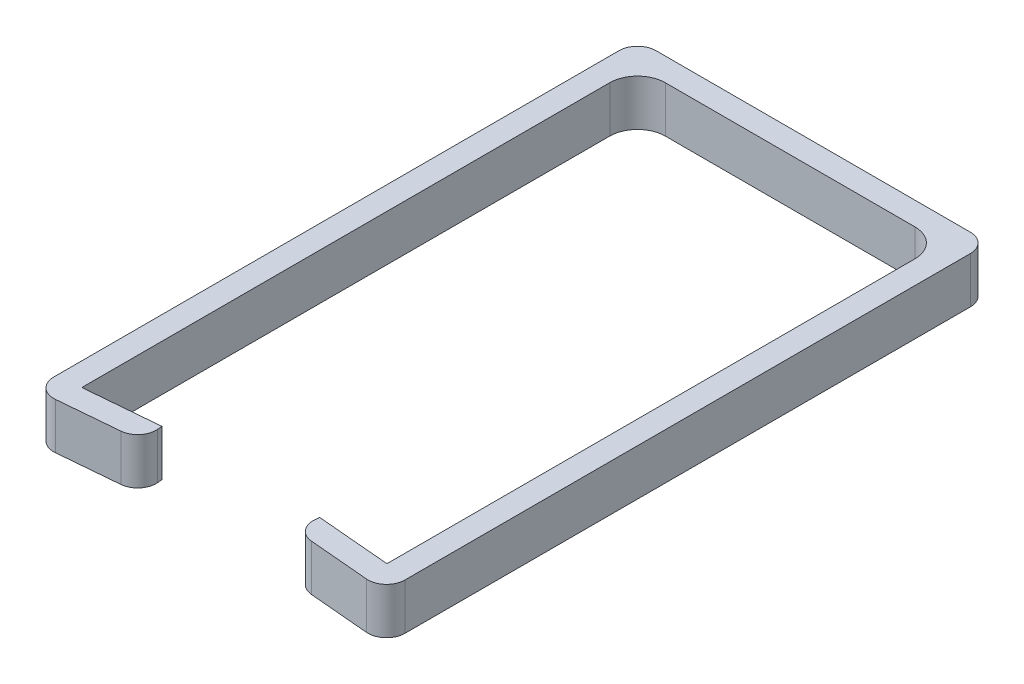
ISO-10303-21;
HEADER;
FILE_DESCRIPTION(('STEP AP214'),'2;1');
FILE_NAME('part.step','',(''),(''),'','','');
FILE_SCHEMA(('AUTOMOTIVE_DESIGN { 1 0 10303 214 1 1 1 1 }'));
ENDSEC;
DATA;
#1=APPLICATION_CONTEXT('core data for automotive mechanical design processes');
#2=APPLICATION_PROTOCOL_DEFINITION('international standard','automotive_design',2000,#1);
#3=PRODUCT_CONTEXT('',#1,'mechanical');
#4=PRODUCT('Part','Part','',(#3));
#5=PRODUCT_RELATED_PRODUCT_CATEGORY('part','',(#4));
#6=PRODUCT_DEFINITION_FORMATION('','',#4);
#7=PRODUCT_DEFINITION_CONTEXT('part definition',#1,'design');
#8=PRODUCT_DEFINITION('design','',#6,#7);
#9=PRODUCT_DEFINITION_SHAPE('','',#8);
#10=(LENGTH_UNIT() NAMED_UNIT(*) SI_UNIT(.MILLI.,.METRE.));
#11=(NAMED_UNIT(*) PLANE_ANGLE_UNIT() SI_UNIT($,.RADIAN.));
#12=(NAMED_UNIT(*) SI_UNIT($,.STERADIAN.) SOLID_ANGLE_UNIT());
#13=UNCERTAINTY_MEASURE_WITH_UNIT(LENGTH_MEASURE(1.E-05),#10,'distance_accuracy_value','');
#14=(GEOMETRIC_REPRESENTATION_CONTEXT(3) GLOBAL_UNCERTAINTY_ASSIGNED_CONTEXT((#13)) GLOBAL_UNIT_ASSIGNED_CONTEXT((#10,
#11,#12)) REPRESENTATION_CONTEXT('',''));
#15=CARTESIAN_POINT('',(0.,0.,0.));
#16=DIRECTION('',(0.,0.,1.));
#17=DIRECTION('',(1.,0.,0.));
#18=AXIS2_PLACEMENT_3D('',#15,#16,#17);
#19=CARTESIAN_POINT('',(0.,5.,0.));
#20=DIRECTION('',(0.087155742747655,0.,0.996194698091746));
#21=DIRECTION('',(0.996194698091746,0.,-0.0871557427476551));
#22=AXIS2_PLACEMENT_3D('',#19,#20,#21);
#23=PLANE('',#22);
#24=DIRECTION('',(-0.996194698091746,0.,0.087155742747655));
#25=VECTOR('',#24,1.);
#26=CARTESIAN_POINT('',(0.,0.,0.));
#27=LINE('',#26,#25);
#28=CARTESIAN_POINT('',(7.96955758473397,0.,-0.69724594198124));
#29=VERTEX_POINT('',#28);
#30=CARTESIAN_POINT('',(0.,0.,0.));
#31=VERTEX_POINT('',#30);
#32=EDGE_CURVE('E204',#29,#31,#27,.T.);
#33=ORIENTED_EDGE('',*,*,#32,.T.);
#34=DIRECTION('',(0.,-1.,0.));
#35=VECTOR('',#34,1.);
#36=CARTESIAN_POINT('',(0.,5.,0.));
#37=LINE('',#36,#35);
#38=CARTESIAN_POINT('',(0.,5.,0.));
#39=VERTEX_POINT('',#38);
#40=EDGE_CURVE('E184',#39,#31,#37,.T.);
#41=ORIENTED_EDGE('',*,*,#40,.F.);
#42=DIRECTION('',(-0.996194698091746,0.,0.087155742747655));
#43=VECTOR('',#42,1.);
#44=CARTESIAN_POINT('',(0.,5.,0.));
#45=LINE('',#44,#43);
#46=CARTESIAN_POINT('',(7.96955758473397,5.,-0.69724594198124));
#47=VERTEX_POINT('',#46);
#48=EDGE_CURVE('E191',#47,#39,#45,.T.);
#49=ORIENTED_EDGE('',*,*,#48,.F.);
#50=DIRECTION('',(0.,-1.,0.));
#51=VECTOR('',#50,1.);
#52=CARTESIAN_POINT('',(7.96955758473397,5.,-0.69724594198124));
#53=LINE('',#52,#51);
#54=EDGE_CURVE('E348',#47,#29,#53,.T.);
#55=ORIENTED_EDGE('',*,*,#54,.T.);
#56=EDGE_LOOP('',(#33,#41,#49,#55));
#57=FACE_BOUND('',#56,.T.);
#58=ADVANCED_FACE('F39',(#57),#23,.F.);
#59=CARTESIAN_POINT('',(0.,5.,0.));
#60=DIRECTION('',(-1.,0.,0.));
#61=DIRECTION('',(0.,0.,1.));
#62=AXIS2_PLACEMENT_3D('',#59,#60,#61);
#63=PLANE('',#62);
#64=DIRECTION('',(0.,0.,-1.));
#65=VECTOR('',#64,1.);
#66=CARTESIAN_POINT('',(0.,0.,0.));
#67=LINE('',#66,#65);
#68=CARTESIAN_POINT('',(0.,0.,-57.1));
#69=VERTEX_POINT('',#68);
#70=EDGE_CURVE('E377',#31,#69,#67,.T.);
#71=ORIENTED_EDGE('',*,*,#70,.T.);
#72=DIRECTION('',(0.,-1.,0.));
#73=VECTOR('',#72,1.);
#74=CARTESIAN_POINT('',(0.,5.,-57.1));
#75=LINE('',#74,#73);
#76=CARTESIAN_POINT('',(0.,5.,-57.1));
#77=VERTEX_POINT('',#76);
#78=EDGE_CURVE('E187',#69,#77,#75,.F.);
#79=ORIENTED_EDGE('',*,*,#78,.T.);
#80=DIRECTION('',(0.,0.,-1.));
#81=VECTOR('',#80,1.);
#82=CARTESIAN_POINT('',(0.,5.,0.));
#83=LINE('',#82,#81);
#84=EDGE_CURVE('E179',#39,#77,#83,.T.);
#85=ORIENTED_EDGE('',*,*,#84,.F.);
#86=ORIENTED_EDGE('',*,*,#40,.T.);
#87=EDGE_LOOP('',(#71,#79,#85,#86));
#88=FACE_BOUND('',#87,.T.);
#89=ADVANCED_FACE('F182',(#88),#63,.F.);
#90=CARTESIAN_POINT('',(0.,5.,-60.1));
#91=DIRECTION('',(0.,0.,-1.));
#92=DIRECTION('',(-1.,0.,0.));
#93=AXIS2_PLACEMENT_3D('',#90,#91,#92);
#94=PLANE('',#93);
#95=DIRECTION('',(1.,0.,0.));
#96=VECTOR('',#95,1.);
#97=CARTESIAN_POINT('',(0.,0.,-60.1));
#98=LINE('',#97,#96);
#99=CARTESIAN_POINT('',(3.,0.,-60.1));
#100=VERTEX_POINT('',#99);
#101=CARTESIAN_POINT('',(30.,0.,-60.1));
#102=VERTEX_POINT('',#101);
#103=EDGE_CURVE('E373',#100,#102,#98,.T.);
#104=ORIENTED_EDGE('',*,*,#103,.T.);
#105=DIRECTION('',(0.,-1.,0.));
#106=VECTOR('',#105,1.);
#107=CARTESIAN_POINT('',(30.,5.,-60.1));
#108=LINE('',#107,#106);
#109=CARTESIAN_POINT('',(30.,5.,-60.1));
#110=VERTEX_POINT('',#109);
#111=EDGE_CURVE('E222',#102,#110,#108,.F.);
#112=ORIENTED_EDGE('',*,*,#111,.T.);
#113=DIRECTION('',(1.,0.,0.));
#114=VECTOR('',#113,1.);
#115=CARTESIAN_POINT('',(0.,5.,-60.1));
#116=LINE('',#115,#114);
#117=CARTESIAN_POINT('',(3.,5.,-60.1));
#118=VERTEX_POINT('',#117);
#119=EDGE_CURVE('E190',#118,#110,#116,.T.);
#120=ORIENTED_EDGE('',*,*,#119,.F.);
#121=DIRECTION('',(0.,-1.,0.));
#122=VECTOR('',#121,1.);
#123=CARTESIAN_POINT('',(3.,0.,-60.1));
#124=LINE('',#123,#122);
#125=EDGE_CURVE('E212',#118,#100,#124,.T.);
#126=ORIENTED_EDGE('',*,*,#125,.T.);
#127=EDGE_LOOP('',(#104,#112,#120,#126));
#128=FACE_BOUND('',#127,.T.);
#129=ADVANCED_FACE('F422',(#128),#94,.F.);
#130=CARTESIAN_POINT('',(33.,5.,-60.1));
#131=DIRECTION('',(1.,0.,0.));
#132=DIRECTION('',(0.,0.,-1.));
#133=AXIS2_PLACEMENT_3D('',#130,#131,#132);
#134=PLANE('',#133);
#135=DIRECTION('',(0.,0.,1.));
#136=VECTOR('',#135,1.);
#137=CARTESIAN_POINT('',(33.,5.,-60.1));
#138=LINE('',#137,#136);
#139=CARTESIAN_POINT('',(33.,5.,-57.1));
#140=VERTEX_POINT('',#139);
#141=CARTESIAN_POINT('',(32.9999999999998,5.,0.));
#142=VERTEX_POINT('',#141);
#143=EDGE_CURVE('E404',#140,#142,#138,.T.);
#144=ORIENTED_EDGE('',*,*,#143,.F.);
#145=DIRECTION('',(0.,-1.,0.));
#146=VECTOR('',#145,1.);
#147=CARTESIAN_POINT('',(33.,0.,-57.1));
#148=LINE('',#147,#146);
#149=CARTESIAN_POINT('',(33.,0.,-57.1));
#150=VERTEX_POINT('',#149);
#151=EDGE_CURVE('E206',#140,#150,#148,.T.);
#152=ORIENTED_EDGE('',*,*,#151,.T.);
#153=DIRECTION('',(0.,0.,1.));
#154=VECTOR('',#153,1.);
#155=CARTESIAN_POINT('',(33.,0.,-60.1));
#156=LINE('',#155,#154);
#157=CARTESIAN_POINT('',(32.9999999999998,0.,0.));
#158=VERTEX_POINT('',#157);
#159=EDGE_CURVE('E368',#150,#158,#156,.T.);
#160=ORIENTED_EDGE('',*,*,#159,.T.);
#161=DIRECTION('',(0.,-1.,0.));
#162=VECTOR('',#161,1.);
#163=CARTESIAN_POINT('',(32.9999999999998,5.,0.));
#164=LINE('',#163,#162);
#165=EDGE_CURVE('E207',#142,#158,#164,.T.);
#166=ORIENTED_EDGE('',*,*,#165,.F.);
#167=EDGE_LOOP('',(#144,#152,#160,#166));
#168=FACE_BOUND('',#167,.T.);
#169=ADVANCED_FACE('F419',(#168),#134,.F.);
#170=CARTESIAN_POINT('',(32.9999999999998,5.,0.));
#171=DIRECTION('',(-0.0871557427476655,0.,0.996194698091745));
#172=DIRECTION('',(0.996194698091745,0.,0.0871557427476655));
#173=AXIS2_PLACEMENT_3D('',#170,#171,#172);
#174=PLANE('',#173);
#175=DIRECTION('',(-0.996194698091745,0.,-0.0871557427476655));
#176=VECTOR('',#175,1.);
#177=CARTESIAN_POINT('',(32.9999999999998,0.,0.));
#178=LINE('',#177,#176);
#179=CARTESIAN_POINT('',(25.0304424152658,0.,-0.697245941981331));
#180=VERTEX_POINT('',#179);
#181=EDGE_CURVE('E365',#158,#180,#178,.T.);
#182=ORIENTED_EDGE('',*,*,#181,.T.);
#183=DIRECTION('',(0.,-1.,0.));
#184=VECTOR('',#183,1.);
#185=CARTESIAN_POINT('',(25.0304424152658,5.,-0.697245941981331));
#186=LINE('',#185,#184);
#187=CARTESIAN_POINT('',(25.0304424152658,5.,-0.697245941981331));
#188=VERTEX_POINT('',#187);
#189=EDGE_CURVE('E215',#188,#180,#186,.T.);
#190=ORIENTED_EDGE('',*,*,#189,.F.);
#191=DIRECTION('',(-0.996194698091745,0.,-0.0871557427476655));
#192=VECTOR('',#191,1.);
#193=CARTESIAN_POINT('',(32.9999999999998,5.,0.));
#194=LINE('',#193,#192);
#195=EDGE_CURVE('E401',#142,#188,#194,.T.);
#196=ORIENTED_EDGE('',*,*,#195,.F.);
#197=ORIENTED_EDGE('',*,*,#165,.T.);
#198=EDGE_LOOP('',(#182,#190,#196,#197));
#199=FACE_BOUND('',#198,.T.);
#200=ADVANCED_FACE('F461',(#199),#174,.F.);
#201=CARTESIAN_POINT('',(25.0304424152658,5.,-0.697245941981331));
#202=DIRECTION('',(0.996194698091745,0.,0.087155742747666));
#203=DIRECTION('',(0.087155742747666,0.,-0.996194698091745));
#204=AXIS2_PLACEMENT_3D('',#201,#202,#203);
#205=PLANE('',#204);
#206=DIRECTION('',(-0.087155742747666,0.,0.996194698091745));
#207=VECTOR('',#206,1.);
#208=CARTESIAN_POINT('',(25.0304424152658,0.,-0.697245941981331));
#209=LINE('',#208,#207);
#210=CARTESIAN_POINT('',(24.986864543892,0.,-0.199148592935459));
#211=VERTEX_POINT('',#210);
#212=EDGE_CURVE('E335',#180,#211,#209,.T.);
#213=ORIENTED_EDGE('',*,*,#212,.T.);
#214=DIRECTION('',(0.,-1.,0.));
#215=VECTOR('',#214,1.);
#216=CARTESIAN_POINT('',(24.986864543892,5.,-0.199148592935459));
#217=LINE('',#216,#215);
#218=CARTESIAN_POINT('',(24.986864543892,5.,-0.199148592935459));
#219=VERTEX_POINT('',#218);
#220=EDGE_CURVE('E299',#211,#219,#217,.F.);
#221=ORIENTED_EDGE('',*,*,#220,.T.);
#222=DIRECTION('',(-0.087155742747666,0.,0.996194698091745));
#223=VECTOR('',#222,1.);
#224=CARTESIAN_POINT('',(25.0304424152658,5.,-0.697245941981331));
#225=LINE('',#224,#223);
#226=EDGE_CURVE('E360',#188,#219,#225,.T.);
#227=ORIENTED_EDGE('',*,*,#226,.F.);
#228=ORIENTED_EDGE('',*,*,#189,.T.);
#229=EDGE_LOOP('',(#213,#221,#227,#228));
#230=FACE_BOUND('',#229,.T.);
#231=ADVANCED_FACE('F357',(#230),#205,.F.);
#232=CARTESIAN_POINT('',(35.4999999999998,5.,2.72827125267319));
#233=DIRECTION('',(0.0871557427476655,0.,-0.996194698091745));
#234=DIRECTION('',(-0.996194698091745,0.,-0.0871557427476655));
#235=AXIS2_PLACEMENT_3D('',#232,#233,#234);
#236=PLANE('',#235);
#237=DIRECTION('',(0.996194698091745,0.,0.0871557427476655));
#238=VECTOR('',#237,1.);
#239=CARTESIAN_POINT('',(35.4999999999998,5.,2.72827125267319));
#240=LINE('',#239,#238);
#241=CARTESIAN_POINT('',(26.8049424545802,5.,1.96755228874336));
#242=VERTEX_POINT('',#241);
#243=CARTESIAN_POINT('',(33.3256885145045,5.,2.53804364671812));
#244=VERTEX_POINT('',#243);
#245=EDGE_CURVE('E395',#242,#244,#240,.T.);
#246=ORIENTED_EDGE('',*,*,#245,.F.);
#247=DIRECTION('',(0.,-1.,0.));
#248=VECTOR('',#247,1.);
#249=CARTESIAN_POINT('',(26.8049424545802,5.,1.96755228874336));
#250=LINE('',#249,#248);
#251=CARTESIAN_POINT('',(26.8049424545802,0.,1.96755228874336));
#252=VERTEX_POINT('',#251);
#253=EDGE_CURVE('E295',#242,#252,#250,.T.);
#254=ORIENTED_EDGE('',*,*,#253,.T.);
#255=DIRECTION('',(0.996194698091745,0.,0.0871557427476655));
#256=VECTOR('',#255,1.);
#257=CARTESIAN_POINT('',(35.4999999999998,0.,2.72827125267319));
#258=LINE('',#257,#256);
#259=CARTESIAN_POINT('',(33.3256885145045,0.,2.53804364671812));
#260=VERTEX_POINT('',#259);
#261=EDGE_CURVE('E329',#252,#260,#258,.T.);
#262=ORIENTED_EDGE('',*,*,#261,.T.);
#263=DIRECTION('',(0.,-1.,0.));
#264=VECTOR('',#263,1.);
#265=CARTESIAN_POINT('',(33.3256885145045,5.,2.53804364671812));
#266=LINE('',#265,#264);
#267=EDGE_CURVE('E292',#260,#244,#266,.F.);
#268=ORIENTED_EDGE('',*,*,#267,.T.);
#269=EDGE_LOOP('',(#246,#254,#262,#268));
#270=FACE_BOUND('',#269,.T.);
#271=ADVANCED_FACE('F456',(#270),#236,.F.);
#272=CARTESIAN_POINT('',(35.5,5.,-62.6));
#273=DIRECTION('',(-1.,0.,0.));
#274=DIRECTION('',(0.,0.,1.));
#275=AXIS2_PLACEMENT_3D('',#272,#273,#274);
#276=PLANE('',#275);
#277=DIRECTION('',(0.,0.,-1.));
#278=VECTOR('',#277,1.);
#279=CARTESIAN_POINT('',(35.5,5.,-62.6));
#280=LINE('',#279,#278);
#281=CARTESIAN_POINT('',(35.4999999999998,5.,0.545654250534641));
#282=VERTEX_POINT('',#281);
#283=CARTESIAN_POINT('',(35.5,5.,-60.6));
#284=VERTEX_POINT('',#283);
#285=EDGE_CURVE('E318',#282,#284,#280,.T.);
#286=ORIENTED_EDGE('',*,*,#285,.F.);
#287=DIRECTION('',(0.,-1.,0.));
#288=VECTOR('',#287,1.);
#289=CARTESIAN_POINT('',(35.4999999999998,5.,0.545654250534641));
#290=LINE('',#289,#288);
#291=CARTESIAN_POINT('',(35.4999999999998,0.,0.545654250534641));
#292=VERTEX_POINT('',#291);
#293=EDGE_CURVE('E305',#282,#292,#290,.T.);
#294=ORIENTED_EDGE('',*,*,#293,.T.);
#295=DIRECTION('',(0.,0.,-1.));
#296=VECTOR('',#295,1.);
#297=CARTESIAN_POINT('',(35.5,0.,-62.6));
#298=LINE('',#297,#296);
#299=CARTESIAN_POINT('',(35.5,0.,-60.6));
#300=VERTEX_POINT('',#299);
#301=EDGE_CURVE('E315',#292,#300,#298,.T.);
#302=ORIENTED_EDGE('',*,*,#301,.T.);
#303=DIRECTION('',(0.,-1.,0.));
#304=VECTOR('',#303,1.);
#305=CARTESIAN_POINT('',(35.5,5.,-60.6));
#306=LINE('',#305,#304);
#307=EDGE_CURVE('E302',#300,#284,#306,.F.);
#308=ORIENTED_EDGE('',*,*,#307,.T.);
#309=EDGE_LOOP('',(#286,#294,#302,#308));
#310=FACE_BOUND('',#309,.T.);
#311=ADVANCED_FACE('F314',(#310),#276,.F.);
#312=CARTESIAN_POINT('',(-2.5,5.,-62.6));
#313=DIRECTION('',(0.,0.,1.));
#314=DIRECTION('',(1.,0.,0.));
#315=AXIS2_PLACEMENT_3D('',#312,#313,#314);
#316=PLANE('',#315);
#317=DIRECTION('',(-1.,0.,0.));
#318=VECTOR('',#317,1.);
#319=CARTESIAN_POINT('',(-2.5,5.,-62.6));
#320=LINE('',#319,#318);
#321=CARTESIAN_POINT('',(33.5,5.,-62.6));
#322=VERTEX_POINT('',#321);
#323=CARTESIAN_POINT('',(-0.5,5.,-62.6));
#324=VERTEX_POINT('',#323);
#325=EDGE_CURVE('E390',#322,#324,#320,.T.);
#326=ORIENTED_EDGE('',*,*,#325,.F.);
#327=DIRECTION('',(0.,-1.,0.));
#328=VECTOR('',#327,1.);
#329=CARTESIAN_POINT('',(33.5,5.,-62.6));
#330=LINE('',#329,#328);
#331=CARTESIAN_POINT('',(33.5,0.,-62.6));
#332=VERTEX_POINT('',#331);
#333=EDGE_CURVE('E11',#322,#332,#330,.T.);
#334=ORIENTED_EDGE('',*,*,#333,.T.);
#335=DIRECTION('',(-1.,0.,0.));
#336=VECTOR('',#335,1.);
#337=CARTESIAN_POINT('',(-2.5,0.,-62.6));
#338=LINE('',#337,#336);
#339=CARTESIAN_POINT('',(-0.5,0.,-62.6));
#340=VERTEX_POINT('',#339);
#341=EDGE_CURVE('E328',#332,#340,#338,.T.);
#342=ORIENTED_EDGE('',*,*,#341,.T.);
#343=DIRECTION('',(0.,-1.,0.));
#344=VECTOR('',#343,1.);
#345=CARTESIAN_POINT('',(-0.5,5.,-62.6));
#346=LINE('',#345,#344);
#347=EDGE_CURVE('E48',#340,#324,#346,.F.);
#348=ORIENTED_EDGE('',*,*,#347,.T.);
#349=EDGE_LOOP('',(#326,#334,#342,#348));
#350=FACE_BOUND('',#349,.T.);
#351=ADVANCED_FACE('F447',(#350),#316,.F.);
#352=CARTESIAN_POINT('',(-2.5,5.,2.72827125267317));
#353=DIRECTION('',(1.,0.,0.));
#354=DIRECTION('',(0.,0.,-1.));
#355=AXIS2_PLACEMENT_3D('',#352,#353,#354);
#356=PLANE('',#355);
#357=DIRECTION('',(0.,0.,1.));
#358=VECTOR('',#357,1.);
#359=CARTESIAN_POINT('',(-2.5,0.,2.72827125267317));
#360=LINE('',#359,#358);
#361=CARTESIAN_POINT('',(-2.5,0.,-60.6));
#362=VERTEX_POINT('',#361);
#363=CARTESIAN_POINT('',(-2.5,0.,0.545654250534634));
#364=VERTEX_POINT('',#363);
#365=EDGE_CURVE('E333',#362,#364,#360,.T.);
#366=ORIENTED_EDGE('',*,*,#365,.T.);
#367=DIRECTION('',(0.,-1.,0.));
#368=VECTOR('',#367,1.);
#369=CARTESIAN_POINT('',(-2.5,5.,0.545654250534634));
#370=LINE('',#369,#368);
#371=CARTESIAN_POINT('',(-2.5,5.,0.545654250534634));
#372=VERTEX_POINT('',#371);
#373=EDGE_CURVE('E268',#364,#372,#370,.F.);
#374=ORIENTED_EDGE('',*,*,#373,.T.);
#375=DIRECTION('',(0.,0.,1.));
#376=VECTOR('',#375,1.);
#377=CARTESIAN_POINT('',(-2.5,5.,2.72827125267317));
#378=LINE('',#377,#376);
#379=CARTESIAN_POINT('',(-2.5,5.,-60.6));
#380=VERTEX_POINT('',#379);
#381=EDGE_CURVE('E387',#380,#372,#378,.T.);
#382=ORIENTED_EDGE('',*,*,#381,.F.);
#383=DIRECTION('',(0.,-1.,0.));
#384=VECTOR('',#383,1.);
#385=CARTESIAN_POINT('',(-2.5,5.,-60.6));
#386=LINE('',#385,#384);
#387=EDGE_CURVE('E264',#380,#362,#386,.T.);
#388=ORIENTED_EDGE('',*,*,#387,.T.);
#389=EDGE_LOOP('',(#366,#374,#382,#388));
#390=FACE_BOUND('',#389,.T.);
#391=ADVANCED_FACE('F443',(#390),#356,.F.);
#392=CARTESIAN_POINT('',(-2.5,5.,2.72827125267317));
#393=DIRECTION('',(-0.087155742747655,0.,-0.996194698091746));
#394=DIRECTION('',(-0.996194698091746,0.,0.087155742747655));
#395=AXIS2_PLACEMENT_3D('',#392,#393,#394);
#396=PLANE('',#395);
#397=DIRECTION('',(0.996194698091746,0.,-0.087155742747655));
#398=VECTOR('',#397,1.);
#399=CARTESIAN_POINT('',(-2.5,5.,2.72827125267317));
#400=LINE('',#399,#398);
#401=CARTESIAN_POINT('',(-0.32568851450469,5.,2.53804364671813));
#402=VERTEX_POINT('',#401);
#403=CARTESIAN_POINT('',(6.19505754541961,5.,1.96755228874343));
#404=VERTEX_POINT('',#403);
#405=EDGE_CURVE('E384',#402,#404,#400,.T.);
#406=ORIENTED_EDGE('',*,*,#405,.F.);
#407=DIRECTION('',(0.,-1.,0.));
#408=VECTOR('',#407,1.);
#409=CARTESIAN_POINT('',(-0.325688514504689,5.,2.53804364671813));
#410=LINE('',#409,#408);
#411=CARTESIAN_POINT('',(-0.32568851450469,0.,2.53804364671813));
#412=VERTEX_POINT('',#411);
#413=EDGE_CURVE('E242',#402,#412,#410,.T.);
#414=ORIENTED_EDGE('',*,*,#413,.T.);
#415=DIRECTION('',(0.996194698091746,0.,-0.087155742747655));
#416=VECTOR('',#415,1.);
#417=CARTESIAN_POINT('',(-2.5,0.,2.72827125267317));
#418=LINE('',#417,#416);
#419=CARTESIAN_POINT('',(6.19505754541961,0.,1.96755228874343));
#420=VERTEX_POINT('',#419);
#421=EDGE_CURVE('E342',#412,#420,#418,.T.);
#422=ORIENTED_EDGE('',*,*,#421,.T.);
#423=DIRECTION('',(0.,-1.,0.));
#424=VECTOR('',#423,1.);
#425=CARTESIAN_POINT('',(6.19505754541961,5.,1.96755228874343));
#426=LINE('',#425,#424);
#427=EDGE_CURVE('E239',#420,#404,#426,.F.);
#428=ORIENTED_EDGE('',*,*,#427,.T.);
#429=EDGE_LOOP('',(#406,#414,#422,#428));
#430=FACE_BOUND('',#429,.T.);
#431=ADVANCED_FACE('F434',(#430),#396,.F.);
#432=CARTESIAN_POINT('',(7.96955758473397,5.,-0.69724594198124));
#433=DIRECTION('',(-0.996194698091746,0.,0.0871557427476549));
#434=DIRECTION('',(0.0871557427476549,0.,0.996194698091746));
#435=AXIS2_PLACEMENT_3D('',#432,#433,#434);
#436=PLANE('',#435);
#437=DIRECTION('',(-0.0871557427476549,0.,-0.996194698091746));
#438=VECTOR('',#437,1.);
#439=CARTESIAN_POINT('',(7.96955758473397,5.,-0.69724594198124));
#440=LINE('',#439,#438);
#441=CARTESIAN_POINT('',(8.01313545610779,5.,-0.199148592935367));
#442=VERTEX_POINT('',#441);
#443=EDGE_CURVE('E196',#442,#47,#440,.T.);
#444=ORIENTED_EDGE('',*,*,#443,.F.);
#445=DIRECTION('',(0.,-1.,0.));
#446=VECTOR('',#445,1.);
#447=CARTESIAN_POINT('',(8.01313545610779,5.,-0.199148592935367));
#448=LINE('',#447,#446);
#449=CARTESIAN_POINT('',(8.01313545610779,0.,-0.199148592935367));
#450=VERTEX_POINT('',#449);
#451=EDGE_CURVE('E288',#442,#450,#448,.T.);
#452=ORIENTED_EDGE('',*,*,#451,.T.);
#453=DIRECTION('',(-0.0871557427476549,0.,-0.996194698091746));
#454=VECTOR('',#453,1.);
#455=CARTESIAN_POINT('',(7.96955758473397,0.,-0.69724594198124));
#456=LINE('',#455,#454);
#457=EDGE_CURVE('E201',#450,#29,#456,.T.);
#458=ORIENTED_EDGE('',*,*,#457,.T.);
#459=ORIENTED_EDGE('',*,*,#54,.F.);
#460=EDGE_LOOP('',(#444,#452,#458,#459));
#461=FACE_BOUND('',#460,.T.);
#462=ADVANCED_FACE('F427',(#461),#436,.F.);
#463=CARTESIAN_POINT('',(0.,5.,0.));
#464=DIRECTION('',(0.,-1.,0.));
#465=DIRECTION('',(0.,0.,-1.));
#466=AXIS2_PLACEMENT_3D('',#463,#464,#465);
#467=PLANE('',#466);
#468=ORIENTED_EDGE('',*,*,#381,.T.);
#469=CARTESIAN_POINT('',(-0.5,5.,0.545654250534634));
#470=DIRECTION('',(0.,-1.,0.));
#471=DIRECTION('',(0.,0.,-1.));
#472=AXIS2_PLACEMENT_3D('',#469,#470,#471);
#473=CIRCLE('',#472,2.);
#474=EDGE_CURVE('E285',#372,#402,#473,.F.);
#475=ORIENTED_EDGE('',*,*,#474,.T.);
#476=ORIENTED_EDGE('',*,*,#405,.T.);
#477=CARTESIAN_POINT('',(6.0207460599243,5.,-0.024837107440057));
#478=DIRECTION('',(0.,-1.,0.));
#479=DIRECTION('',(0.,0.,-1.));
#480=AXIS2_PLACEMENT_3D('',#477,#478,#479);
#481=CIRCLE('',#480,2.);
#482=EDGE_CURVE('E55',#404,#442,#481,.F.);
#483=ORIENTED_EDGE('',*,*,#482,.T.);
#484=ORIENTED_EDGE('',*,*,#443,.T.);
#485=ORIENTED_EDGE('',*,*,#48,.T.);
#486=ORIENTED_EDGE('',*,*,#84,.T.);
#487=CARTESIAN_POINT('',(3.,5.,-57.1));
#488=DIRECTION('',(0.,-1.,0.));
#489=DIRECTION('',(0.,0.,-1.));
#490=AXIS2_PLACEMENT_3D('',#487,#488,#489);
#491=CIRCLE('',#490,3.);
#492=EDGE_CURVE('E236',#77,#118,#491,.T.);
#493=ORIENTED_EDGE('',*,*,#492,.T.);
#494=ORIENTED_EDGE('',*,*,#119,.T.);
#495=CARTESIAN_POINT('',(30.,5.,-57.1));
#496=DIRECTION('',(0.,-1.,0.));
#497=DIRECTION('',(0.,0.,-1.));
#498=AXIS2_PLACEMENT_3D('',#495,#496,#497);
#499=CIRCLE('',#498,3.);
#500=EDGE_CURVE('E230',#110,#140,#499,.T.);
#501=ORIENTED_EDGE('',*,*,#500,.T.);
#502=ORIENTED_EDGE('',*,*,#143,.T.);
#503=ORIENTED_EDGE('',*,*,#195,.T.);
#504=ORIENTED_EDGE('',*,*,#226,.T.);
#505=CARTESIAN_POINT('',(26.9792539400755,5.,-0.024837107440127));
#506=DIRECTION('',(0.,-1.,0.));
#507=DIRECTION('',(0.,0.,-1.));
#508=AXIS2_PLACEMENT_3D('',#505,#506,#507);
#509=CIRCLE('',#508,2.);
#510=EDGE_CURVE('E280',#219,#242,#509,.F.);
#511=ORIENTED_EDGE('',*,*,#510,.T.);
#512=ORIENTED_EDGE('',*,*,#245,.T.);
#513=CARTESIAN_POINT('',(33.4999999999998,5.,0.545654250534627));
#514=DIRECTION('',(0.,-1.,0.));
#515=DIRECTION('',(0.,0.,-1.));
#516=AXIS2_PLACEMENT_3D('',#513,#514,#515);
#517=CIRCLE('',#516,2.);
#518=EDGE_CURVE('E277',#244,#282,#517,.F.);
#519=ORIENTED_EDGE('',*,*,#518,.T.);
#520=ORIENTED_EDGE('',*,*,#285,.T.);
#521=CARTESIAN_POINT('',(33.5,5.,-60.6));
#522=DIRECTION('',(0.,-1.,0.));
#523=DIRECTION('',(0.,0.,-1.));
#524=AXIS2_PLACEMENT_3D('',#521,#522,#523);
#525=CIRCLE('',#524,2.);
#526=EDGE_CURVE('E274',#284,#322,#525,.F.);
#527=ORIENTED_EDGE('',*,*,#526,.T.);
#528=ORIENTED_EDGE('',*,*,#325,.T.);
#529=CARTESIAN_POINT('',(-0.5,5.,-60.6));
#530=DIRECTION('',(0.,-1.,0.));
#531=DIRECTION('',(0.,0.,-1.));
#532=AXIS2_PLACEMENT_3D('',#529,#530,#531);
#533=CIRCLE('',#532,2.);
#534=EDGE_CURVE('E271',#324,#380,#533,.F.);
#535=ORIENTED_EDGE('',*,*,#534,.T.);
#536=EDGE_LOOP('',(#468,#475,#476,#483,#484,#485,#486,#493,#494,#501,#502,#503,#504,#511,#512,
#519,#520,#527,#528,#535));
#537=FACE_BOUND('',#536,.T.);
#538=ADVANCED_FACE('F195',(#537),#467,.F.);
#539=CARTESIAN_POINT('',(0.,0.,0.));
#540=DIRECTION('',(0.,-1.,0.));
#541=DIRECTION('',(0.,0.,-1.));
#542=AXIS2_PLACEMENT_3D('',#539,#540,#541);
#543=PLANE('',#542);
#544=ORIENTED_EDGE('',*,*,#421,.F.);
#545=CARTESIAN_POINT('',(-0.5,0.,0.545654250534634));
#546=DIRECTION('',(0.,-1.,0.));
#547=DIRECTION('',(0.,0.,-1.));
#548=AXIS2_PLACEMENT_3D('',#545,#546,#547);
#549=CIRCLE('',#548,2.);
#550=EDGE_CURVE('E261',#412,#364,#549,.T.);
#551=ORIENTED_EDGE('',*,*,#550,.T.);
#552=ORIENTED_EDGE('',*,*,#365,.F.);
#553=CARTESIAN_POINT('',(-0.5,0.,-60.6));
#554=DIRECTION('',(0.,-1.,0.));
#555=DIRECTION('',(0.,0.,-1.));
#556=AXIS2_PLACEMENT_3D('',#553,#554,#555);
#557=CIRCLE('',#556,2.);
#558=EDGE_CURVE('E246',#362,#340,#557,.T.);
#559=ORIENTED_EDGE('',*,*,#558,.T.);
#560=ORIENTED_EDGE('',*,*,#341,.F.);
#561=CARTESIAN_POINT('',(33.5,0.,-60.6));
#562=DIRECTION('',(0.,-1.,0.));
#563=DIRECTION('',(0.,0.,-1.));
#564=AXIS2_PLACEMENT_3D('',#561,#562,#563);
#565=CIRCLE('',#564,2.);
#566=EDGE_CURVE('E249',#332,#300,#565,.T.);
#567=ORIENTED_EDGE('',*,*,#566,.T.);
#568=ORIENTED_EDGE('',*,*,#301,.F.);
#569=CARTESIAN_POINT('',(33.4999999999998,0.,0.545654250534627));
#570=DIRECTION('',(0.,-1.,0.));
#571=DIRECTION('',(0.,0.,-1.));
#572=AXIS2_PLACEMENT_3D('',#569,#570,#571);
#573=CIRCLE('',#572,2.);
#574=EDGE_CURVE('E252',#292,#260,#573,.T.);
#575=ORIENTED_EDGE('',*,*,#574,.T.);
#576=ORIENTED_EDGE('',*,*,#261,.F.);
#577=CARTESIAN_POINT('',(26.9792539400755,0.,-0.024837107440127));
#578=DIRECTION('',(0.,-1.,0.));
#579=DIRECTION('',(0.,0.,-1.));
#580=AXIS2_PLACEMENT_3D('',#577,#578,#579);
#581=CIRCLE('',#580,2.);
#582=EDGE_CURVE('E255',#252,#211,#581,.T.);
#583=ORIENTED_EDGE('',*,*,#582,.T.);
#584=ORIENTED_EDGE('',*,*,#212,.F.);
#585=ORIENTED_EDGE('',*,*,#181,.F.);
#586=ORIENTED_EDGE('',*,*,#159,.F.);
#587=CARTESIAN_POINT('',(30.,0.,-57.1));
#588=DIRECTION('',(0.,-1.,0.));
#589=DIRECTION('',(0.,0.,-1.));
#590=AXIS2_PLACEMENT_3D('',#587,#588,#589);
#591=CIRCLE('',#590,3.);
#592=EDGE_CURVE('E227',#150,#102,#591,.F.);
#593=ORIENTED_EDGE('',*,*,#592,.T.);
#594=ORIENTED_EDGE('',*,*,#103,.F.);
#595=CARTESIAN_POINT('',(3.,0.,-57.1));
#596=DIRECTION('',(0.,-1.,0.));
#597=DIRECTION('',(0.,0.,-1.));
#598=AXIS2_PLACEMENT_3D('',#595,#596,#597);
#599=CIRCLE('',#598,3.);
#600=EDGE_CURVE('E233',#100,#69,#599,.F.);
#601=ORIENTED_EDGE('',*,*,#600,.T.);
#602=ORIENTED_EDGE('',*,*,#70,.F.);
#603=ORIENTED_EDGE('',*,*,#32,.F.);
#604=ORIENTED_EDGE('',*,*,#457,.F.);
#605=CARTESIAN_POINT('',(6.0207460599243,0.,-0.024837107440057));
#606=DIRECTION('',(0.,-1.,0.));
#607=DIRECTION('',(0.,0.,-1.));
#608=AXIS2_PLACEMENT_3D('',#605,#606,#607);
#609=CIRCLE('',#608,2.);
#610=EDGE_CURVE('E258',#450,#420,#609,.T.);
#611=ORIENTED_EDGE('',*,*,#610,.T.);
#612=EDGE_LOOP('',(#544,#551,#552,#559,#560,#567,#568,#575,#576,#583,#584,#585,#586,#593,#594,
#601,#602,#603,#604,#611));
#613=FACE_BOUND('',#612,.T.);
#614=ADVANCED_FACE('F323',(#613),#543,.T.);
#615=CARTESIAN_POINT('',(30.,5.,-57.1));
#616=DIRECTION('',(0.,1.,0.));
#617=DIRECTION('',(0.,0.,1.));
#618=AXIS2_PLACEMENT_3D('',#615,#616,#617);
#619=CYLINDRICAL_SURFACE('',#618,3.);
#620=ORIENTED_EDGE('',*,*,#500,.F.);
#621=ORIENTED_EDGE('',*,*,#111,.F.);
#622=ORIENTED_EDGE('',*,*,#592,.F.);
#623=ORIENTED_EDGE('',*,*,#151,.F.);
#624=EDGE_LOOP('',(#620,#621,#622,#623));
#625=FACE_BOUND('',#624,.T.);
#626=ADVANCED_FACE('F417',(#625),#619,.F.);
#627=CARTESIAN_POINT('',(3.,5.,-57.1));
#628=DIRECTION('',(0.,1.,0.));
#629=DIRECTION('',(0.,0.,1.));
#630=AXIS2_PLACEMENT_3D('',#627,#628,#629);
#631=CYLINDRICAL_SURFACE('',#630,3.);
#632=ORIENTED_EDGE('',*,*,#492,.F.);
#633=ORIENTED_EDGE('',*,*,#78,.F.);
#634=ORIENTED_EDGE('',*,*,#600,.F.);
#635=ORIENTED_EDGE('',*,*,#125,.F.);
#636=EDGE_LOOP('',(#632,#633,#634,#635));
#637=FACE_BOUND('',#636,.T.);
#638=ADVANCED_FACE('F424',(#637),#631,.F.);
#639=CARTESIAN_POINT('',(-0.5,5.,0.545654250534634));
#640=DIRECTION('',(0.,-1.,0.));
#641=DIRECTION('',(0.,0.,-1.));
#642=AXIS2_PLACEMENT_3D('',#639,#640,#641);
#643=CYLINDRICAL_SURFACE('',#642,2.);
#644=ORIENTED_EDGE('',*,*,#474,.F.);
#645=ORIENTED_EDGE('',*,*,#373,.F.);
#646=ORIENTED_EDGE('',*,*,#550,.F.);
#647=ORIENTED_EDGE('',*,*,#413,.F.);
#648=EDGE_LOOP('',(#644,#645,#646,#647));
#649=FACE_BOUND('',#648,.T.);
#650=ADVANCED_FACE('F440',(#649),#643,.T.);
#651=CARTESIAN_POINT('',(6.0207460599243,5.,-0.024837107440057));
#652=DIRECTION('',(0.,-1.,0.));
#653=DIRECTION('',(0.,0.,-1.));
#654=AXIS2_PLACEMENT_3D('',#651,#652,#653);
#655=CYLINDRICAL_SURFACE('',#654,2.);
#656=ORIENTED_EDGE('',*,*,#482,.F.);
#657=ORIENTED_EDGE('',*,*,#427,.F.);
#658=ORIENTED_EDGE('',*,*,#610,.F.);
#659=ORIENTED_EDGE('',*,*,#451,.F.);
#660=EDGE_LOOP('',(#656,#657,#658,#659));
#661=FACE_BOUND('',#660,.T.);
#662=ADVANCED_FACE('F430',(#661),#655,.T.);
#663=CARTESIAN_POINT('',(26.9792539400755,5.,-0.024837107440127));
#664=DIRECTION('',(0.,-1.,0.));
#665=DIRECTION('',(0.,0.,-1.));
#666=AXIS2_PLACEMENT_3D('',#663,#664,#665);
#667=CYLINDRICAL_SURFACE('',#666,2.);
#668=ORIENTED_EDGE('',*,*,#510,.F.);
#669=ORIENTED_EDGE('',*,*,#220,.F.);
#670=ORIENTED_EDGE('',*,*,#582,.F.);
#671=ORIENTED_EDGE('',*,*,#253,.F.);
#672=EDGE_LOOP('',(#668,#669,#670,#671));
#673=FACE_BOUND('',#672,.T.);
#674=ADVANCED_FACE('F460',(#673),#667,.T.);
#675=CARTESIAN_POINT('',(33.4999999999998,5.,0.545654250534627));
#676=DIRECTION('',(0.,-1.,0.));
#677=DIRECTION('',(0.,0.,-1.));
#678=AXIS2_PLACEMENT_3D('',#675,#676,#677);
#679=CYLINDRICAL_SURFACE('',#678,2.);
#680=ORIENTED_EDGE('',*,*,#518,.F.);
#681=ORIENTED_EDGE('',*,*,#267,.F.);
#682=ORIENTED_EDGE('',*,*,#574,.F.);
#683=ORIENTED_EDGE('',*,*,#293,.F.);
#684=EDGE_LOOP('',(#680,#681,#682,#683));
#685=FACE_BOUND('',#684,.T.);
#686=ADVANCED_FACE('F454',(#685),#679,.T.);
#687=CARTESIAN_POINT('',(33.5,5.,-60.6));
#688=DIRECTION('',(0.,-1.,0.));
#689=DIRECTION('',(0.,0.,-1.));
#690=AXIS2_PLACEMENT_3D('',#687,#688,#689);
#691=CYLINDRICAL_SURFACE('',#690,2.);
#692=ORIENTED_EDGE('',*,*,#526,.F.);
#693=ORIENTED_EDGE('',*,*,#307,.F.);
#694=ORIENTED_EDGE('',*,*,#566,.F.);
#695=ORIENTED_EDGE('',*,*,#333,.F.);
#696=EDGE_LOOP('',(#692,#693,#694,#695));
#697=FACE_BOUND('',#696,.T.);
#698=ADVANCED_FACE('F451',(#697),#691,.T.);
#699=CARTESIAN_POINT('',(-0.5,5.,-60.6));
#700=DIRECTION('',(0.,-1.,0.));
#701=DIRECTION('',(0.,0.,-1.));
#702=AXIS2_PLACEMENT_3D('',#699,#700,#701);
#703=CYLINDRICAL_SURFACE('',#702,2.);
#704=ORIENTED_EDGE('',*,*,#534,.F.);
#705=ORIENTED_EDGE('',*,*,#347,.F.);
#706=ORIENTED_EDGE('',*,*,#558,.F.);
#707=ORIENTED_EDGE('',*,*,#387,.F.);
#708=EDGE_LOOP('',(#704,#705,#706,#707));
#709=FACE_BOUND('',#708,.T.);
#710=ADVANCED_FACE('F41',(#709),#703,.T.);
#711=CLOSED_SHELL('',(#58,#89,#129,#169,#200,#231,#271,#311,#351,#391,#431,#462,#538,#614,#626,
#638,#650,#662,#674,#686,#698,#710));
#712=MANIFOLD_SOLID_BREP('B2',#711);
#713=ADVANCED_BREP_SHAPE_REPRESENTATION('',(#18,#712),#14);
#714=SHAPE_DEFINITION_REPRESENTATION(#9,#713);
ENDSEC;
END-ISO-10303-21;
